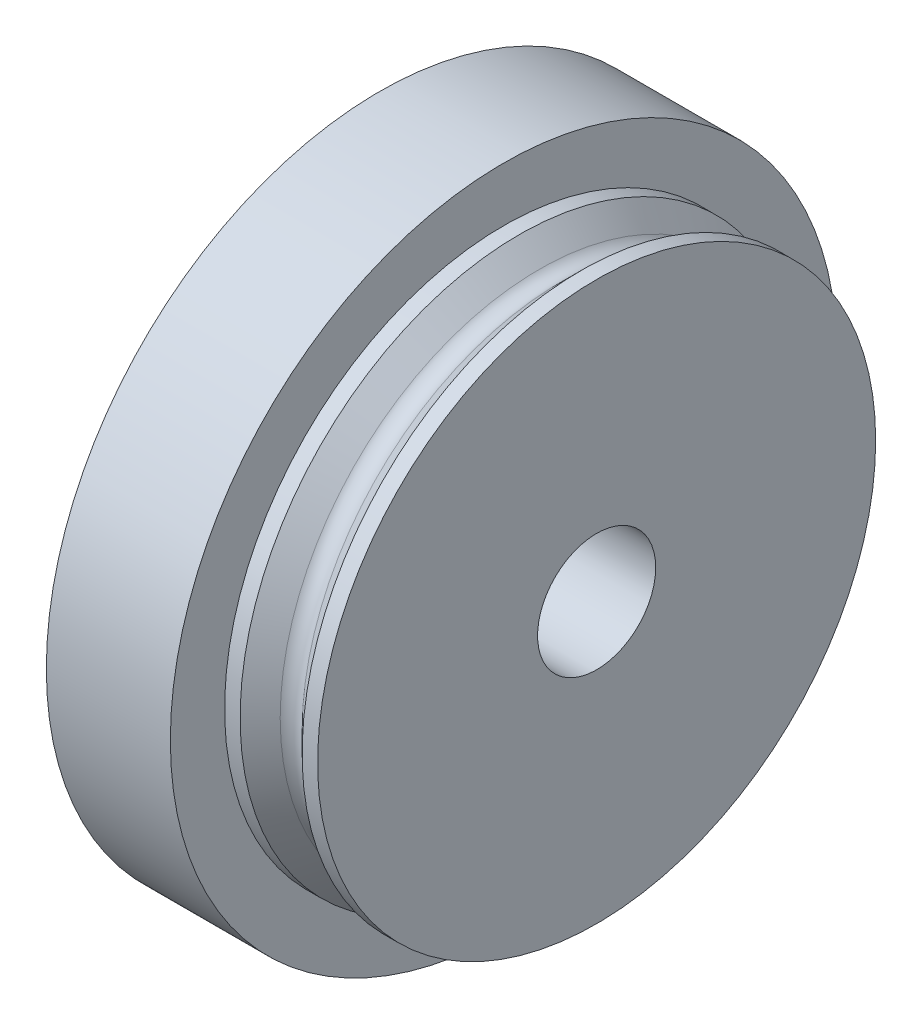
ISO-10303-21;
HEADER;
FILE_DESCRIPTION(('STEP AP214'),'2;1');
FILE_NAME('part.step','',(''),(''),'','','');
FILE_SCHEMA(('AUTOMOTIVE_DESIGN { 1 0 10303 214 1 1 1 1 }'));
ENDSEC;
DATA;
#1=APPLICATION_CONTEXT('core data for automotive mechanical design processes');
#2=APPLICATION_PROTOCOL_DEFINITION('international standard','automotive_design',2000,#1);
#3=PRODUCT_CONTEXT('',#1,'mechanical');
#4=PRODUCT('Part','Part','',(#3));
#5=PRODUCT_RELATED_PRODUCT_CATEGORY('part','',(#4));
#6=PRODUCT_DEFINITION_FORMATION('','',#4);
#7=PRODUCT_DEFINITION_CONTEXT('part definition',#1,'design');
#8=PRODUCT_DEFINITION('design','',#6,#7);
#9=PRODUCT_DEFINITION_SHAPE('','',#8);
#10=(LENGTH_UNIT() NAMED_UNIT(*) SI_UNIT(.MILLI.,.METRE.));
#11=(NAMED_UNIT(*) PLANE_ANGLE_UNIT() SI_UNIT($,.RADIAN.));
#12=(NAMED_UNIT(*) SI_UNIT($,.STERADIAN.) SOLID_ANGLE_UNIT());
#13=UNCERTAINTY_MEASURE_WITH_UNIT(LENGTH_MEASURE(1.E-05),#10,'distance_accuracy_value','');
#14=(GEOMETRIC_REPRESENTATION_CONTEXT(3) GLOBAL_UNCERTAINTY_ASSIGNED_CONTEXT((#13)) GLOBAL_UNIT_ASSIGNED_CONTEXT((#10,
#11,#12)) REPRESENTATION_CONTEXT('',''));
#15=CARTESIAN_POINT('',(0.,0.,0.));
#16=DIRECTION('',(0.,0.,1.));
#17=DIRECTION('',(1.,0.,0.));
#18=AXIS2_PLACEMENT_3D('',#15,#16,#17);
#19=CARTESIAN_POINT('',(-14.,0.,0.));
#20=DIRECTION('',(-1.,0.,0.));
#21=DIRECTION('',(0.,0.,1.));
#22=AXIS2_PLACEMENT_3D('',#19,#20,#21);
#23=PLANE('',#22);
#24=CARTESIAN_POINT('',(-14.,0.,0.));
#25=DIRECTION('',(-1.,0.,0.));
#26=DIRECTION('',(0.,0.,1.));
#27=AXIS2_PLACEMENT_3D('',#24,#25,#26);
#28=CIRCLE('',#27,21.5);
#29=CARTESIAN_POINT('',(-14.,0.,21.5));
#30=VERTEX_POINT('',#29);
#31=EDGE_CURVE('E11',#30,#30,#28,.T.);
#32=ORIENTED_EDGE('',*,*,#31,.T.);
#33=EDGE_LOOP('',(#32));
#34=FACE_BOUND('',#33,.T.);
#35=CARTESIAN_POINT('',(-14.,0.,0.));
#36=DIRECTION('',(-1.,0.,0.));
#37=DIRECTION('',(0.,0.,1.));
#38=AXIS2_PLACEMENT_3D('',#35,#36,#37);
#39=CIRCLE('',#38,7.81);
#40=CARTESIAN_POINT('',(-14.,0.,7.81));
#41=VERTEX_POINT('',#40);
#42=EDGE_CURVE('E52',#41,#41,#39,.T.);
#43=ORIENTED_EDGE('',*,*,#42,.F.);
#44=EDGE_LOOP('',(#43));
#45=FACE_BOUND('',#44,.T.);
#46=ADVANCED_FACE('F41',(#34,#45),#23,.T.);
#47=CARTESIAN_POINT('',(-6.,0.,0.));
#48=DIRECTION('',(-1.,0.,0.));
#49=DIRECTION('',(0.,0.,1.));
#50=AXIS2_PLACEMENT_3D('',#47,#48,#49);
#51=PLANE('',#50);
#52=CARTESIAN_POINT('',(-6.,0.,0.));
#53=DIRECTION('',(-1.,0.,0.));
#54=DIRECTION('',(0.,0.,1.));
#55=AXIS2_PLACEMENT_3D('',#52,#53,#54);
#56=CIRCLE('',#55,21.5);
#57=CARTESIAN_POINT('',(-6.,0.,21.5));
#58=VERTEX_POINT('',#57);
#59=EDGE_CURVE('E45',#58,#58,#56,.T.);
#60=ORIENTED_EDGE('',*,*,#59,.F.);
#61=EDGE_LOOP('',(#60));
#62=FACE_BOUND('',#61,.T.);
#63=CARTESIAN_POINT('',(-6.,0.,0.));
#64=DIRECTION('',(-1.,0.,0.));
#65=DIRECTION('',(0.,0.,1.));
#66=AXIS2_PLACEMENT_3D('',#63,#64,#65);
#67=CIRCLE('',#66,7.81);
#68=CARTESIAN_POINT('',(-6.,0.,7.81));
#69=VERTEX_POINT('',#68);
#70=EDGE_CURVE('E54',#69,#69,#67,.T.);
#71=ORIENTED_EDGE('',*,*,#70,.T.);
#72=EDGE_LOOP('',(#71));
#73=FACE_BOUND('',#72,.T.);
#74=ADVANCED_FACE('F64',(#62,#73),#51,.F.);
#75=CARTESIAN_POINT('',(-14.,0.,0.));
#76=DIRECTION('',(1.,0.,0.));
#77=DIRECTION('',(0.,0.,-1.));
#78=AXIS2_PLACEMENT_3D('',#75,#76,#77);
#79=CYLINDRICAL_SURFACE('',#78,21.5);
#80=ORIENTED_EDGE('',*,*,#31,.F.);
#81=EDGE_LOOP('',(#80));
#82=FACE_BOUND('',#81,.T.);
#83=ORIENTED_EDGE('',*,*,#59,.T.);
#84=EDGE_LOOP('',(#83));
#85=FACE_BOUND('',#84,.T.);
#86=ADVANCED_FACE('F43',(#82,#85),#79,.T.);
#87=CARTESIAN_POINT('',(-14.,0.,0.));
#88=DIRECTION('',(1.,0.,0.));
#89=DIRECTION('',(0.,0.,-1.));
#90=AXIS2_PLACEMENT_3D('',#87,#88,#89);
#91=CYLINDRICAL_SURFACE('',#90,7.81);
#92=ORIENTED_EDGE('',*,*,#42,.T.);
#93=EDGE_LOOP('',(#92));
#94=FACE_BOUND('',#93,.T.);
#95=ORIENTED_EDGE('',*,*,#70,.F.);
#96=EDGE_LOOP('',(#95));
#97=FACE_BOUND('',#96,.T.);
#98=ADVANCED_FACE('F60',(#94,#97),#91,.F.);
#99=CLOSED_SHELL('',(#46,#74,#86,#98));
#100=MANIFOLD_SOLID_BREP('B2',#99);
#101=CARTESIAN_POINT('',(0.,0.,0.));
#102=DIRECTION('',(1.,0.,0.));
#103=DIRECTION('',(0.,0.,-1.));
#104=AXIS2_PLACEMENT_3D('',#101,#102,#103);
#105=CYLINDRICAL_SURFACE('',#104,18.);
#106=CARTESIAN_POINT('',(-5.,0.,0.));
#107=DIRECTION('',(1.,0.,0.));
#108=DIRECTION('',(0.,0.,-1.));
#109=AXIS2_PLACEMENT_3D('',#106,#107,#108);
#110=CIRCLE('',#109,18.);
#111=CARTESIAN_POINT('',(-5.,0.,-18.));
#112=VERTEX_POINT('',#111);
#113=EDGE_CURVE('E129',#112,#112,#110,.T.);
#114=ORIENTED_EDGE('',*,*,#113,.F.);
#115=EDGE_LOOP('',(#114));
#116=FACE_BOUND('',#115,.T.);
#117=CARTESIAN_POINT('',(-6.,0.,0.));
#118=DIRECTION('',(1.,0.,0.));
#119=DIRECTION('',(0.,0.,-1.));
#120=AXIS2_PLACEMENT_3D('',#117,#118,#119);
#121=CIRCLE('',#120,18.);
#122=CARTESIAN_POINT('',(-6.,0.,-18.));
#123=VERTEX_POINT('',#122);
#124=EDGE_CURVE('E123',#123,#123,#121,.T.);
#125=ORIENTED_EDGE('',*,*,#124,.T.);
#126=EDGE_LOOP('',(#125));
#127=FACE_BOUND('',#126,.T.);
#128=ADVANCED_FACE('F103',(#116,#127),#105,.T.);
#129=CARTESIAN_POINT('',(0.,18.,0.));
#130=DIRECTION('',(1.,0.,0.));
#131=DIRECTION('',(0.,0.,-1.));
#132=AXIS2_PLACEMENT_3D('',#129,#130,#131);
#133=PLANE('',#132);
#134=CARTESIAN_POINT('',(0.,0.,0.));
#135=DIRECTION('',(1.,0.,0.));
#136=DIRECTION('',(0.,0.,-1.));
#137=AXIS2_PLACEMENT_3D('',#134,#135,#136);
#138=CIRCLE('',#137,18.);
#139=CARTESIAN_POINT('',(0.,0.,-18.));
#140=VERTEX_POINT('',#139);
#141=EDGE_CURVE('E126',#140,#140,#138,.T.);
#142=ORIENTED_EDGE('',*,*,#141,.T.);
#143=EDGE_LOOP('',(#142));
#144=FACE_BOUND('',#143,.T.);
#145=CARTESIAN_POINT('',(0.,0.,0.));
#146=DIRECTION('',(1.,0.,0.));
#147=DIRECTION('',(0.,0.,-1.));
#148=AXIS2_PLACEMENT_3D('',#145,#146,#147);
#149=CIRCLE('',#148,3.81);
#150=CARTESIAN_POINT('',(0.,0.,-3.81));
#151=VERTEX_POINT('',#150);
#152=EDGE_CURVE('E40',#151,#151,#149,.T.);
#153=ORIENTED_EDGE('',*,*,#152,.F.);
#154=EDGE_LOOP('',(#153));
#155=FACE_BOUND('',#154,.T.);
#156=ADVANCED_FACE('F105',(#144,#155),#133,.T.);
#157=CARTESIAN_POINT('',(0.,0.,0.));
#158=DIRECTION('',(1.,0.,0.));
#159=DIRECTION('',(0.,0.,-1.));
#160=AXIS2_PLACEMENT_3D('',#157,#158,#159);
#161=CYLINDRICAL_SURFACE('',#160,3.81);
#162=ORIENTED_EDGE('',*,*,#152,.T.);
#163=EDGE_LOOP('',(#162));
#164=FACE_BOUND('',#163,.T.);
#165=CARTESIAN_POINT('',(-14.,0.,0.));
#166=DIRECTION('',(1.,0.,0.));
#167=DIRECTION('',(0.,0.,-1.));
#168=AXIS2_PLACEMENT_3D('',#165,#166,#167);
#169=CIRCLE('',#168,3.81);
#170=CARTESIAN_POINT('',(-14.,0.,-3.81));
#171=VERTEX_POINT('',#170);
#172=EDGE_CURVE('E110',#171,#171,#169,.T.);
#173=ORIENTED_EDGE('',*,*,#172,.F.);
#174=EDGE_LOOP('',(#173));
#175=FACE_BOUND('',#174,.T.);
#176=ADVANCED_FACE('F182',(#164,#175),#161,.F.);
#177=CARTESIAN_POINT('',(-14.,3.81,0.));
#178=DIRECTION('',(-1.,0.,0.));
#179=DIRECTION('',(0.,0.,1.));
#180=AXIS2_PLACEMENT_3D('',#177,#178,#179);
#181=PLANE('',#180);
#182=ORIENTED_EDGE('',*,*,#172,.T.);
#183=EDGE_LOOP('',(#182));
#184=FACE_BOUND('',#183,.T.);
#185=CARTESIAN_POINT('',(-14.,0.,0.));
#186=DIRECTION('',(1.,0.,0.));
#187=DIRECTION('',(0.,0.,-1.));
#188=AXIS2_PLACEMENT_3D('',#185,#186,#187);
#189=CIRCLE('',#188,7.81);
#190=CARTESIAN_POINT('',(-14.,0.,-7.81));
#191=VERTEX_POINT('',#190);
#192=EDGE_CURVE('E114',#191,#191,#189,.T.);
#193=ORIENTED_EDGE('',*,*,#192,.F.);
#194=EDGE_LOOP('',(#193));
#195=FACE_BOUND('',#194,.T.);
#196=ADVANCED_FACE('F177',(#184,#195),#181,.T.);
#197=CARTESIAN_POINT('',(0.,0.,0.));
#198=DIRECTION('',(1.,0.,0.));
#199=DIRECTION('',(0.,0.,-1.));
#200=AXIS2_PLACEMENT_3D('',#197,#198,#199);
#201=CYLINDRICAL_SURFACE('',#200,7.81);
#202=ORIENTED_EDGE('',*,*,#192,.T.);
#203=EDGE_LOOP('',(#202));
#204=FACE_BOUND('',#203,.T.);
#205=CARTESIAN_POINT('',(-6.,0.,0.));
#206=DIRECTION('',(1.,0.,0.));
#207=DIRECTION('',(0.,0.,-1.));
#208=AXIS2_PLACEMENT_3D('',#205,#206,#207);
#209=CIRCLE('',#208,7.81);
#210=CARTESIAN_POINT('',(-6.,0.,-7.81));
#211=VERTEX_POINT('',#210);
#212=EDGE_CURVE('E118',#211,#211,#209,.T.);
#213=ORIENTED_EDGE('',*,*,#212,.F.);
#214=EDGE_LOOP('',(#213));
#215=FACE_BOUND('',#214,.T.);
#216=ADVANCED_FACE('F170',(#204,#215),#201,.T.);
#217=CARTESIAN_POINT('',(-6.,7.81,0.));
#218=DIRECTION('',(-1.,0.,0.));
#219=DIRECTION('',(0.,0.,1.));
#220=AXIS2_PLACEMENT_3D('',#217,#218,#219);
#221=PLANE('',#220);
#222=ORIENTED_EDGE('',*,*,#212,.T.);
#223=EDGE_LOOP('',(#222));
#224=FACE_BOUND('',#223,.T.);
#225=ORIENTED_EDGE('',*,*,#124,.F.);
#226=EDGE_LOOP('',(#225));
#227=FACE_BOUND('',#226,.T.);
#228=ADVANCED_FACE('F168',(#224,#227),#221,.T.);
#229=CARTESIAN_POINT('',(-1.,0.,0.));
#230=DIRECTION('',(1.,0.,0.));
#231=DIRECTION('',(0.,0.,-1.));
#232=AXIS2_PLACEMENT_3D('',#229,#230,#231);
#233=CIRCLE('',#232,18.);
#234=CARTESIAN_POINT('',(-1.,0.,-18.));
#235=VERTEX_POINT('',#234);
#236=EDGE_CURVE('E138',#235,#235,#233,.T.);
#237=ORIENTED_EDGE('',*,*,#236,.T.);
#238=EDGE_LOOP('',(#237));
#239=FACE_BOUND('',#238,.T.);
#240=ORIENTED_EDGE('',*,*,#141,.F.);
#241=EDGE_LOOP('',(#240));
#242=FACE_BOUND('',#241,.T.);
#243=ADVANCED_FACE('F142',(#239,#242),#105,.T.);
#244=CARTESIAN_POINT('',(-5.,0.,0.));
#245=DIRECTION('',(-1.,0.,0.));
#246=DIRECTION('',(0.,0.,1.));
#247=AXIS2_PLACEMENT_3D('',#244,#245,#246);
#248=CONICAL_SURFACE('',#247,18.,0.785398163397449);
#249=CARTESIAN_POINT('',(-3.70710678118655,0.,0.));
#250=DIRECTION('',(1.,0.,0.));
#251=DIRECTION('',(0.,0.,-1.));
#252=AXIS2_PLACEMENT_3D('',#249,#250,#251);
#253=CIRCLE('',#252,16.7071067811865);
#254=CARTESIAN_POINT('',(-3.70710678118655,0.,-16.7071067811865));
#255=VERTEX_POINT('',#254);
#256=EDGE_CURVE('E132',#255,#255,#253,.T.);
#257=ORIENTED_EDGE('',*,*,#256,.F.);
#258=EDGE_LOOP('',(#257));
#259=FACE_BOUND('',#258,.T.);
#260=ORIENTED_EDGE('',*,*,#113,.T.);
#261=EDGE_LOOP('',(#260));
#262=FACE_BOUND('',#261,.T.);
#263=ADVANCED_FACE('F154',(#259,#262),#248,.T.);
#264=CARTESIAN_POINT('',(-3.,0.,0.));
#265=DIRECTION('',(1.,0.,0.));
#266=DIRECTION('',(0.,0.,-1.));
#267=AXIS2_PLACEMENT_3D('',#264,#265,#266);
#268=TOROIDAL_SURFACE('',#267,17.4142135623731,0.999999999999999);
#269=CARTESIAN_POINT('',(-2.29289321881345,0.,0.));
#270=DIRECTION('',(1.,0.,0.));
#271=DIRECTION('',(0.,0.,-1.));
#272=AXIS2_PLACEMENT_3D('',#269,#270,#271);
#273=CIRCLE('',#272,16.7071067811865);
#274=CARTESIAN_POINT('',(-2.29289321881345,0.,-16.7071067811865));
#275=VERTEX_POINT('',#274);
#276=EDGE_CURVE('E135',#275,#275,#273,.T.);
#277=ORIENTED_EDGE('',*,*,#276,.F.);
#278=EDGE_LOOP('',(#277));
#279=FACE_BOUND('',#278,.T.);
#280=ORIENTED_EDGE('',*,*,#256,.T.);
#281=EDGE_LOOP('',(#280));
#282=FACE_BOUND('',#281,.T.);
#283=ADVANCED_FACE('F148',(#279,#282),#268,.F.);
#284=CARTESIAN_POINT('',(-2.29289321881345,0.,0.));
#285=DIRECTION('',(1.,0.,0.));
#286=DIRECTION('',(0.,0.,-1.));
#287=AXIS2_PLACEMENT_3D('',#284,#285,#286);
#288=CONICAL_SURFACE('',#287,16.7071067811865,0.785398163397449);
#289=ORIENTED_EDGE('',*,*,#236,.F.);
#290=EDGE_LOOP('',(#289));
#291=FACE_BOUND('',#290,.T.);
#292=ORIENTED_EDGE('',*,*,#276,.T.);
#293=EDGE_LOOP('',(#292));
#294=FACE_BOUND('',#293,.T.);
#295=ADVANCED_FACE('F145',(#291,#294),#288,.T.);
#296=CLOSED_SHELL('',(#128,#156,#176,#196,#216,#228,#243,#263,#283,#295));
#297=MANIFOLD_SOLID_BREP('B6',#296);
#298=ADVANCED_BREP_SHAPE_REPRESENTATION('',(#18,#100,#297),#14);
#299=SHAPE_DEFINITION_REPRESENTATION(#9,#298);
ENDSEC;
END-ISO-10303-21;
